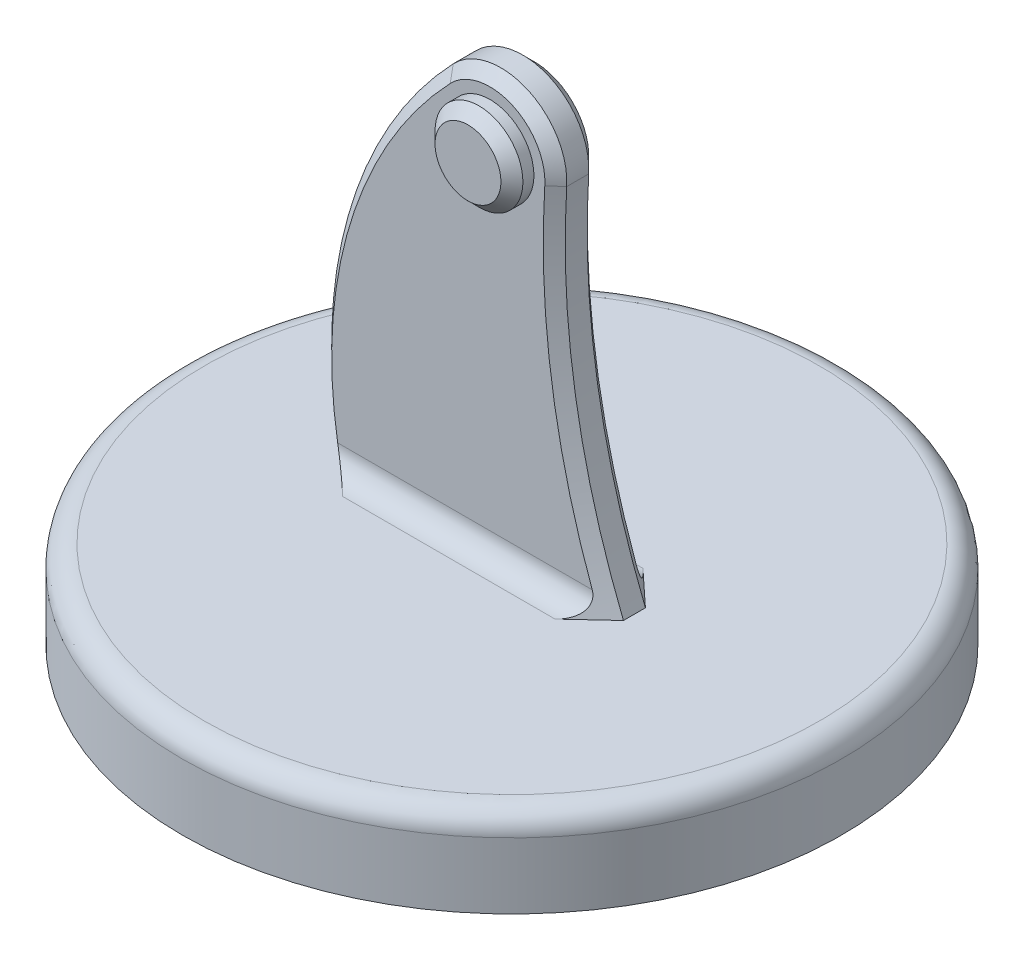
ISO-10303-21;
HEADER;
FILE_DESCRIPTION(('STEP AP214'),'2;1');
FILE_NAME('part.step','',(''),(''),'','','');
FILE_SCHEMA(('AUTOMOTIVE_DESIGN { 1 0 10303 214 1 1 1 1 }'));
ENDSEC;
DATA;
#1=APPLICATION_CONTEXT('core data for automotive mechanical design processes');
#2=APPLICATION_PROTOCOL_DEFINITION('international standard','automotive_design',2000,#1);
#3=PRODUCT_CONTEXT('',#1,'mechanical');
#4=PRODUCT('Part','Part','',(#3));
#5=PRODUCT_RELATED_PRODUCT_CATEGORY('part','',(#4));
#6=PRODUCT_DEFINITION_FORMATION('','',#4);
#7=PRODUCT_DEFINITION_CONTEXT('part definition',#1,'design');
#8=PRODUCT_DEFINITION('design','',#6,#7);
#9=PRODUCT_DEFINITION_SHAPE('','',#8);
#10=(LENGTH_UNIT() NAMED_UNIT(*) SI_UNIT(.MILLI.,.METRE.));
#11=(NAMED_UNIT(*) PLANE_ANGLE_UNIT() SI_UNIT($,.RADIAN.));
#12=(NAMED_UNIT(*) SI_UNIT($,.STERADIAN.) SOLID_ANGLE_UNIT());
#13=UNCERTAINTY_MEASURE_WITH_UNIT(LENGTH_MEASURE(1.E-05),#10,'distance_accuracy_value','');
#14=(GEOMETRIC_REPRESENTATION_CONTEXT(3) GLOBAL_UNCERTAINTY_ASSIGNED_CONTEXT((#13)) GLOBAL_UNIT_ASSIGNED_CONTEXT((#10,
#11,#12)) REPRESENTATION_CONTEXT('',''));
#15=CARTESIAN_POINT('',(0.,0.,0.));
#16=DIRECTION('',(0.,0.,1.));
#17=DIRECTION('',(1.,0.,0.));
#18=AXIS2_PLACEMENT_3D('',#15,#16,#17);
#19=CARTESIAN_POINT('',(0.,20.,0.));
#20=DIRECTION('',(0.,1.,0.));
#21=DIRECTION('',(0.,0.,1.));
#22=AXIS2_PLACEMENT_3D('',#19,#20,#21);
#23=PLANE('',#22);
#24=CARTESIAN_POINT('',(0.,20.,0.));
#25=DIRECTION('',(0.,1.,0.));
#26=DIRECTION('',(0.,0.,1.));
#27=AXIS2_PLACEMENT_3D('',#24,#25,#26);
#28=CIRCLE('',#27,70.);
#29=CARTESIAN_POINT('',(0.,20.,70.));
#30=VERTEX_POINT('',#29);
#31=EDGE_CURVE('E333',#30,#30,#28,.T.);
#32=ORIENTED_EDGE('',*,*,#31,.T.);
#33=EDGE_LOOP('',(#32));
#34=FACE_BOUND('',#33,.T.);
#35=CARTESIAN_POINT('',(-36.2257918410724,20.,-2.50000000000005));
#36=CARTESIAN_POINT('',(-35.372613344394,20.,-3.33359235450625));
#37=CARTESIAN_POINT('',(-34.5191891841924,20.,-4.16693335697092));
#38=CARTESIAN_POINT('',(-32.810937278002,20.,-5.83391380233447));
#39=CARTESIAN_POINT('',(-31.956108987226,20.,-6.66755268694829));
#40=CARTESIAN_POINT('',(-30.2458713230934,20.,-8.33423473891843));
#41=CARTESIAN_POINT('',(-29.3904619495462,20.,-9.16727790607917));
#42=CARTESIAN_POINT('',(-28.5347400447997,20.,-9.99999999999034));
#43=B_SPLINE_CURVE_WITH_KNOTS('',3,(#35,#36,#37,#38,#39,#40,#41,#42),.UNSPECIFIED.,.F.,.F.,(4,2,
2,4),(0.,3.57842257820063,7.16048411375374,10.7425468249048),.UNSPECIFIED.);
#44=CARTESIAN_POINT('',(-36.2257918410724,20.,-2.50000000000005));
#45=VERTEX_POINT('',#44);
#46=CARTESIAN_POINT('',(-28.5347400447997,20.,-10.));
#47=VERTEX_POINT('',#46);
#48=EDGE_CURVE('E203',#45,#47,#43,.T.);
#49=ORIENTED_EDGE('',*,*,#48,.T.);
#50=DIRECTION('',(-1.,0.,0.));
#51=VECTOR('',#50,1.);
#52=CARTESIAN_POINT('',(25.1824752050036,20.,-10.));
#53=LINE('',#52,#51);
#54=CARTESIAN_POINT('',(19.8084097202196,20.,-10.));
#55=VERTEX_POINT('',#54);
#56=EDGE_CURVE('E165',#47,#55,#53,.F.);
#57=ORIENTED_EDGE('',*,*,#56,.T.);
#58=CARTESIAN_POINT('',(19.8084097202196,20.,-10.));
#59=CARTESIAN_POINT('',(20.7032286114695,20.,-9.16574365323038));
#60=CARTESIAN_POINT('',(21.5984643871198,20.,-8.3319343297424));
#61=CARTESIAN_POINT('',(23.3898068938445,20.,-6.66525336176841));
#62=CARTESIAN_POINT('',(24.2859136241594,20.,-5.83238171646611));
#63=CARTESIAN_POINT('',(26.0805990637617,20.,-4.16616784041951));
#64=CARTESIAN_POINT('',(26.979179359604,20.,-3.33282731858597));
#65=CARTESIAN_POINT('',(27.8782351753599,20.,-2.50000000000006));
#66=B_SPLINE_CURVE_WITH_KNOTS('',3,(#58,#59,#60,#61,#62,#63,#64,#65),.UNSPECIFIED.,.F.,.F.,(4,2,
2,4),(0.,3.67017170974666,7.34034022201679,11.0169040821687),.UNSPECIFIED.);
#67=CARTESIAN_POINT('',(27.8782351753599,20.,-2.50000000000005));
#68=VERTEX_POINT('',#67);
#69=EDGE_CURVE('E211',#55,#68,#66,.T.);
#70=ORIENTED_EDGE('',*,*,#69,.T.);
#71=DIRECTION('',(0.,0.,-1.));
#72=VECTOR('',#71,1.);
#73=CARTESIAN_POINT('',(27.8782351753599,20.,5.));
#74=LINE('',#73,#72);
#75=CARTESIAN_POINT('',(27.8782351753599,20.,2.5));
#76=VERTEX_POINT('',#75);
#77=EDGE_CURVE('E140',#68,#76,#74,.F.);
#78=ORIENTED_EDGE('',*,*,#77,.T.);
#79=CARTESIAN_POINT('',(27.8782351753599,20.,2.5));
#80=CARTESIAN_POINT('',(26.979179359604,20.,3.33282731858595));
#81=CARTESIAN_POINT('',(26.0805990637617,20.,4.1661678404195));
#82=CARTESIAN_POINT('',(24.2859136241592,20.,5.83238171646611));
#83=CARTESIAN_POINT('',(23.3898068938443,20.,6.66525336176839));
#84=CARTESIAN_POINT('',(21.5984643871196,20.,8.33193432974237));
#85=CARTESIAN_POINT('',(20.7032286114693,20.,9.16574365323034));
#86=CARTESIAN_POINT('',(19.8084097202194,20.,10.));
#87=B_SPLINE_CURVE_WITH_KNOTS('',3,(#79,#80,#81,#82,#83,#84,#85,#86),.UNSPECIFIED.,.F.,.F.,(4,2,
2,4),(0.,3.67656386015204,7.34673237242222,11.0169040821689),.UNSPECIFIED.);
#88=CARTESIAN_POINT('',(19.8084097202194,20.,10.));
#89=VERTEX_POINT('',#88);
#90=EDGE_CURVE('E162',#76,#89,#87,.T.);
#91=ORIENTED_EDGE('',*,*,#90,.T.);
#92=DIRECTION('',(-1.,0.,0.));
#93=VECTOR('',#92,1.);
#94=CARTESIAN_POINT('',(0.,20.,10.));
#95=LINE('',#94,#93);
#96=CARTESIAN_POINT('',(-28.5347400447895,20.,10.));
#97=VERTEX_POINT('',#96);
#98=EDGE_CURVE('E161',#89,#97,#95,.T.);
#99=ORIENTED_EDGE('',*,*,#98,.T.);
#100=CARTESIAN_POINT('',(-28.5347400447895,20.,10.));
#101=CARTESIAN_POINT('',(-29.3904619495377,20.,9.16727790608722));
#102=CARTESIAN_POINT('',(-30.2458713230866,20.,8.33423473892487));
#103=CARTESIAN_POINT('',(-31.9561089872225,20.,6.66755268695151));
#104=CARTESIAN_POINT('',(-32.8109372780002,20.,5.83391380233608));
#105=CARTESIAN_POINT('',(-34.5191891841924,20.,4.16693335697091));
#106=CARTESIAN_POINT('',(-35.372613344394,20.,3.33359235450621));
#107=CARTESIAN_POINT('',(-36.2257918410724,20.,2.49999999999999));
#108=B_SPLINE_CURVE_WITH_KNOTS('',3,(#100,#101,#102,#103,#104,#105,#106,#107),.UNSPECIFIED.,.F.,
.F.,(4,2,2,4),(0.,3.582062711158,7.1641242467181,10.7425468249188),.UNSPECIFIED.);
#109=CARTESIAN_POINT('',(-36.2257918410724,20.,2.5));
#110=VERTEX_POINT('',#109);
#111=EDGE_CURVE('E231',#97,#110,#108,.T.);
#112=ORIENTED_EDGE('',*,*,#111,.T.);
#113=DIRECTION('',(0.,0.,-1.));
#114=VECTOR('',#113,1.);
#115=CARTESIAN_POINT('',(-36.2257918410724,20.,5.));
#116=LINE('',#115,#114);
#117=EDGE_CURVE('E342',#45,#110,#116,.F.);
#118=ORIENTED_EDGE('',*,*,#117,.F.);
#119=EDGE_LOOP('',(#49,#57,#70,#78,#91,#99,#112,#118));
#120=FACE_BOUND('',#119,.T.);
#121=ADVANCED_FACE('F40',(#34,#120),#23,.T.);
#122=CARTESIAN_POINT('',(0.,20.,0.));
#123=DIRECTION('',(0.,-1.,0.));
#124=DIRECTION('',(0.,0.,-1.));
#125=AXIS2_PLACEMENT_3D('',#122,#123,#124);
#126=CYLINDRICAL_SURFACE('',#125,75.);
#127=CARTESIAN_POINT('',(0.,15.,0.));
#128=DIRECTION('',(0.,1.,0.));
#129=DIRECTION('',(0.,0.,1.));
#130=AXIS2_PLACEMENT_3D('',#127,#128,#129);
#131=CIRCLE('',#130,75.);
#132=CARTESIAN_POINT('',(0.,15.,75.));
#133=VERTEX_POINT('',#132);
#134=EDGE_CURVE('E339',#133,#133,#131,.F.);
#135=ORIENTED_EDGE('',*,*,#134,.T.);
#136=EDGE_LOOP('',(#135));
#137=FACE_BOUND('',#136,.T.);
#138=CARTESIAN_POINT('',(0.,0.,0.));
#139=DIRECTION('',(0.,1.,0.));
#140=DIRECTION('',(0.,0.,1.));
#141=AXIS2_PLACEMENT_3D('',#138,#139,#140);
#142=CIRCLE('',#141,75.);
#143=CARTESIAN_POINT('',(0.,0.,75.));
#144=VERTEX_POINT('',#143);
#145=EDGE_CURVE('E330',#144,#144,#142,.T.);
#146=ORIENTED_EDGE('',*,*,#145,.T.);
#147=EDGE_LOOP('',(#146));
#148=FACE_BOUND('',#147,.T.);
#149=ADVANCED_FACE('F223',(#137,#148),#126,.T.);
#150=CARTESIAN_POINT('',(0.,0.,0.));
#151=DIRECTION('',(0.,1.,0.));
#152=DIRECTION('',(0.,0.,1.));
#153=AXIS2_PLACEMENT_3D('',#150,#151,#152);
#154=PLANE('',#153);
#155=ORIENTED_EDGE('',*,*,#145,.F.);
#156=EDGE_LOOP('',(#155));
#157=FACE_BOUND('',#156,.T.);
#158=ADVANCED_FACE('F227',(#157),#154,.F.);
#159=CARTESIAN_POINT('',(0.,15.,0.));
#160=DIRECTION('',(0.,1.,0.));
#161=DIRECTION('',(0.,0.,1.));
#162=AXIS2_PLACEMENT_3D('',#159,#160,#161);
#163=TOROIDAL_SURFACE('',#162,70.,5.);
#164=ORIENTED_EDGE('',*,*,#134,.F.);
#165=EDGE_LOOP('',(#164));
#166=FACE_BOUND('',#165,.T.);
#167=ORIENTED_EDGE('',*,*,#31,.F.);
#168=EDGE_LOOP('',(#167));
#169=FACE_BOUND('',#168,.T.);
#170=ADVANCED_FACE('F199',(#166,#169),#163,.T.);
#171=CARTESIAN_POINT('',(194.618391581677,87.8064911464742,5.));
#172=DIRECTION('',(0.,0.,-1.));
#173=DIRECTION('',(-1.,0.,0.));
#174=AXIS2_PLACEMENT_3D('',#171,#172,#173);
#175=CYLINDRICAL_SURFACE('',#174,180.);
#176=ORIENTED_EDGE('',*,*,#77,.F.);
#177=CARTESIAN_POINT('',(194.618391581677,87.8064911464742,-2.50000000000005));
#178=DIRECTION('',(0.,0.,-1.));
#179=DIRECTION('',(-1.,0.,0.));
#180=AXIS2_PLACEMENT_3D('',#177,#178,#179);
#181=CIRCLE('',#180,180.);
#182=CARTESIAN_POINT('',(14.9706455062829,99.062037780498,-2.50000000000005));
#183=VERTEX_POINT('',#182);
#184=EDGE_CURVE('E357',#68,#183,#181,.T.);
#185=ORIENTED_EDGE('',*,*,#184,.T.);
#186=DIRECTION('',(0.,0.,-1.));
#187=VECTOR('',#186,1.);
#188=CARTESIAN_POINT('',(14.9706455062829,99.062037780498,5.));
#189=LINE('',#188,#187);
#190=CARTESIAN_POINT('',(14.9706455062829,99.062037780498,2.5));
#191=VERTEX_POINT('',#190);
#192=EDGE_CURVE('E148',#191,#183,#189,.T.);
#193=ORIENTED_EDGE('',*,*,#192,.F.);
#194=CARTESIAN_POINT('',(194.618391581677,87.8064911464742,2.5));
#195=DIRECTION('',(0.,0.,-1.));
#196=DIRECTION('',(-1.,0.,0.));
#197=AXIS2_PLACEMENT_3D('',#194,#195,#196);
#198=CIRCLE('',#197,180.);
#199=EDGE_CURVE('E355',#191,#76,#198,.F.);
#200=ORIENTED_EDGE('',*,*,#199,.T.);
#201=EDGE_LOOP('',(#176,#185,#193,#200));
#202=FACE_BOUND('',#201,.T.);
#203=ADVANCED_FACE('F225',(#202),#175,.F.);
#204=CARTESIAN_POINT('',(0.,100.,5.));
#205=DIRECTION('',(0.,0.,-1.));
#206=DIRECTION('',(-1.,0.,0.));
#207=AXIS2_PLACEMENT_3D('',#204,#205,#206);
#208=CYLINDRICAL_SURFACE('',#207,15.);
#209=ORIENTED_EDGE('',*,*,#192,.T.);
#210=CARTESIAN_POINT('',(0.,100.,-2.50000000000005));
#211=DIRECTION('',(0.,0.,-1.));
#212=DIRECTION('',(-1.,0.,0.));
#213=AXIS2_PLACEMENT_3D('',#210,#211,#212);
#214=CIRCLE('',#213,15.);
#215=CARTESIAN_POINT('',(-10.8492014290604,110.358321695703,-2.50000000000005));
#216=VERTEX_POINT('',#215);
#217=EDGE_CURVE('E143',#183,#216,#214,.F.);
#218=ORIENTED_EDGE('',*,*,#217,.T.);
#219=DIRECTION('',(0.,0.,-1.));
#220=VECTOR('',#219,1.);
#221=CARTESIAN_POINT('',(-10.8492014290604,110.358321695703,5.));
#222=LINE('',#221,#220);
#223=CARTESIAN_POINT('',(-10.8492014290604,110.358321695703,2.5));
#224=VERTEX_POINT('',#223);
#225=EDGE_CURVE('E144',#224,#216,#222,.T.);
#226=ORIENTED_EDGE('',*,*,#225,.F.);
#227=CARTESIAN_POINT('',(0.,100.,2.5));
#228=DIRECTION('',(0.,0.,-1.));
#229=DIRECTION('',(-1.,0.,0.));
#230=AXIS2_PLACEMENT_3D('',#227,#228,#229);
#231=CIRCLE('',#230,15.);
#232=EDGE_CURVE('E328',#224,#191,#231,.T.);
#233=ORIENTED_EDGE('',*,*,#232,.T.);
#234=EDGE_LOOP('',(#209,#218,#226,#233));
#235=FACE_BOUND('',#234,.T.);
#236=ADVANCED_FACE('F316',(#235),#208,.T.);
#237=CARTESIAN_POINT('',(61.4788080980091,41.3028437243492,5.));
#238=DIRECTION('',(0.,0.,-1.));
#239=DIRECTION('',(-1.,0.,0.));
#240=AXIS2_PLACEMENT_3D('',#237,#238,#239);
#241=CYLINDRICAL_SURFACE('',#240,100.);
#242=ORIENTED_EDGE('',*,*,#225,.T.);
#243=CARTESIAN_POINT('',(61.4788080980091,41.3028437243492,-2.50000000000005));
#244=DIRECTION('',(0.,0.,-1.));
#245=DIRECTION('',(-1.,0.,0.));
#246=AXIS2_PLACEMENT_3D('',#243,#244,#245);
#247=CIRCLE('',#246,100.);
#248=EDGE_CURVE('E351',#216,#45,#247,.F.);
#249=ORIENTED_EDGE('',*,*,#248,.T.);
#250=ORIENTED_EDGE('',*,*,#117,.T.);
#251=CARTESIAN_POINT('',(61.4788080980091,41.3028437243492,2.5));
#252=DIRECTION('',(0.,0.,-1.));
#253=DIRECTION('',(-1.,0.,0.));
#254=AXIS2_PLACEMENT_3D('',#251,#252,#253);
#255=CIRCLE('',#254,100.);
#256=EDGE_CURVE('E348',#110,#224,#255,.T.);
#257=ORIENTED_EDGE('',*,*,#256,.T.);
#258=EDGE_LOOP('',(#242,#249,#250,#257));
#259=FACE_BOUND('',#258,.T.);
#260=ADVANCED_FACE('F310',(#259),#241,.T.);
#261=CARTESIAN_POINT('',(194.618391581677,87.8064911464742,5.));
#262=DIRECTION('',(0.,0.,-1.));
#263=DIRECTION('',(-1.,0.,0.));
#264=AXIS2_PLACEMENT_3D('',#261,#262,#263);
#265=PLANE('',#264);
#266=CARTESIAN_POINT('',(0.,100.,5.));
#267=DIRECTION('',(0.,0.,-1.));
#268=DIRECTION('',(-1.,0.,0.));
#269=AXIS2_PLACEMENT_3D('',#266,#267,#268);
#270=CIRCLE('',#269,10.);
#271=CARTESIAN_POINT('',(-10.,100.,5.));
#272=VERTEX_POINT('',#271);
#273=EDGE_CURVE('E283',#272,#272,#270,.F.);
#274=ORIENTED_EDGE('',*,*,#273,.F.);
#275=EDGE_LOOP('',(#274));
#276=FACE_BOUND('',#275,.T.);
#277=CARTESIAN_POINT('',(61.4788080980091,41.3028437243492,5.));
#278=DIRECTION('',(0.,0.,-1.));
#279=DIRECTION('',(-1.,0.,0.));
#280=AXIS2_PLACEMENT_3D('',#277,#278,#279);
#281=CIRCLE('',#280,97.4999999999999);
#282=CARTESIAN_POINT('',(-9.04100119088367,108.631934746419,5.));
#283=VERTEX_POINT('',#282);
#284=CARTESIAN_POINT('',(-34.6485412178825,25.,5.));
#285=VERTEX_POINT('',#284);
#286=EDGE_CURVE('E212',#283,#285,#281,.F.);
#287=ORIENTED_EDGE('',*,*,#286,.T.);
#288=DIRECTION('',(-1.,0.,0.));
#289=VECTOR('',#288,1.);
#290=CARTESIAN_POINT('',(194.618391581677,25.,5.));
#291=LINE('',#290,#289);
#292=CARTESIAN_POINT('',(23.2661384016624,25.,5.));
#293=VERTEX_POINT('',#292);
#294=EDGE_CURVE('E56',#285,#293,#291,.F.);
#295=ORIENTED_EDGE('',*,*,#294,.T.);
#296=CARTESIAN_POINT('',(194.618391581677,87.8064911464742,5.));
#297=DIRECTION('',(0.,0.,-1.));
#298=DIRECTION('',(-1.,0.,0.));
#299=AXIS2_PLACEMENT_3D('',#296,#297,#298);
#300=CIRCLE('',#299,182.5);
#301=CARTESIAN_POINT('',(12.4755379219024,99.2183648170817,5.));
#302=VERTEX_POINT('',#301);
#303=EDGE_CURVE('E359',#293,#302,#300,.T.);
#304=ORIENTED_EDGE('',*,*,#303,.T.);
#305=CARTESIAN_POINT('',(0.,100.,5.));
#306=DIRECTION('',(0.,0.,-1.));
#307=DIRECTION('',(-1.,0.,0.));
#308=AXIS2_PLACEMENT_3D('',#305,#306,#307);
#309=CIRCLE('',#308,12.5);
#310=EDGE_CURVE('E360',#302,#283,#309,.F.);
#311=ORIENTED_EDGE('',*,*,#310,.T.);
#312=EDGE_LOOP('',(#287,#295,#304,#311));
#313=FACE_BOUND('',#312,.T.);
#314=ADVANCED_FACE('F307',(#276,#313),#265,.F.);
#315=CARTESIAN_POINT('',(194.618391581677,87.8064911464742,-5.));
#316=DIRECTION('',(0.,0.,-1.));
#317=DIRECTION('',(-1.,0.,0.));
#318=AXIS2_PLACEMENT_3D('',#315,#316,#317);
#319=PLANE('',#318);
#320=CARTESIAN_POINT('',(0.,100.,-5.));
#321=DIRECTION('',(0.,0.,-1.));
#322=DIRECTION('',(-1.,0.,0.));
#323=AXIS2_PLACEMENT_3D('',#320,#321,#322);
#324=CIRCLE('',#323,5.);
#325=CARTESIAN_POINT('',(-5.,100.,-5.));
#326=VERTEX_POINT('',#325);
#327=EDGE_CURVE('E447',#326,#326,#324,.T.);
#328=ORIENTED_EDGE('',*,*,#327,.F.);
#329=EDGE_LOOP('',(#328));
#330=FACE_BOUND('',#329,.T.);
#331=CARTESIAN_POINT('',(194.618391581677,87.8064911464742,-5.));
#332=DIRECTION('',(0.,0.,-1.));
#333=DIRECTION('',(-1.,0.,0.));
#334=AXIS2_PLACEMENT_3D('',#331,#332,#333);
#335=CIRCLE('',#334,182.5);
#336=CARTESIAN_POINT('',(12.4755379219025,99.2183648170817,-5.));
#337=VERTEX_POINT('',#336);
#338=CARTESIAN_POINT('',(23.2661384016625,25.,-5.));
#339=VERTEX_POINT('',#338);
#340=EDGE_CURVE('E123',#337,#339,#335,.F.);
#341=ORIENTED_EDGE('',*,*,#340,.T.);
#342=DIRECTION('',(-1.,0.,0.));
#343=VECTOR('',#342,1.);
#344=CARTESIAN_POINT('',(-33.6654972978262,25.,-5.));
#345=LINE('',#344,#343);
#346=CARTESIAN_POINT('',(-34.6485412178826,25.,-5.));
#347=VERTEX_POINT('',#346);
#348=EDGE_CURVE('E159',#339,#347,#345,.T.);
#349=ORIENTED_EDGE('',*,*,#348,.T.);
#350=CARTESIAN_POINT('',(61.4788080980091,41.3028437243492,-5.));
#351=DIRECTION('',(0.,0.,-1.));
#352=DIRECTION('',(-1.,0.,0.));
#353=AXIS2_PLACEMENT_3D('',#350,#351,#352);
#354=CIRCLE('',#353,97.5000000000001);
#355=CARTESIAN_POINT('',(-9.04100119088373,108.631934746419,-5.));
#356=VERTEX_POINT('',#355);
#357=EDGE_CURVE('E126',#347,#356,#354,.T.);
#358=ORIENTED_EDGE('',*,*,#357,.T.);
#359=CARTESIAN_POINT('',(0.,100.,-5.));
#360=DIRECTION('',(0.,0.,-1.));
#361=DIRECTION('',(-1.,0.,0.));
#362=AXIS2_PLACEMENT_3D('',#359,#360,#361);
#363=CIRCLE('',#362,12.5000000000001);
#364=EDGE_CURVE('E119',#356,#337,#363,.T.);
#365=ORIENTED_EDGE('',*,*,#364,.T.);
#366=EDGE_LOOP('',(#341,#349,#358,#365));
#367=FACE_BOUND('',#366,.T.);
#368=ADVANCED_FACE('F121',(#330,#367),#319,.T.);
#369=CARTESIAN_POINT('',(194.618391581677,87.8064911464742,-2.50000000000005));
#370=DIRECTION('',(0.,0.,-1.));
#371=DIRECTION('',(-1.,0.,0.));
#372=AXIS2_PLACEMENT_3D('',#369,#370,#371);
#373=CONICAL_SURFACE('',#372,180.,0.785398163397448);
#374=ORIENTED_EDGE('',*,*,#69,.F.);
#375=CARTESIAN_POINT('',(19.8084097202196,20.,-10.));
#376=CARTESIAN_POINT('',(19.9616222001361,20.0000298804788,-9.85714704113471));
#377=CARTESIAN_POINT('',(20.1137924014272,20.0061250464787,-9.71309524720425));
#378=CARTESIAN_POINT('',(20.4154099258563,20.0312732005136,-9.42286389259003));
#379=CARTESIAN_POINT('',(20.5648530266058,20.0503447774578,-9.27668157427058));
#380=CARTESIAN_POINT('',(20.8615528966935,20.102562652016,-8.98125926298962));
#381=CARTESIAN_POINT('',(21.0087676549956,20.1358611613083,-8.83200332023084));
#382=CARTESIAN_POINT('',(21.2980316141235,20.2175964036354,-8.53280806026068));
#383=CARTESIAN_POINT('',(21.4400838108926,20.2660241950172,-8.38286919811181));
#384=CARTESIAN_POINT('',(21.7828151280986,20.4058352198909,-8.01276165533595));
#385=CARTESIAN_POINT('',(21.9797828513876,20.5067135935973,-7.79259954802384));
#386=CARTESIAN_POINT('',(22.3528762269487,20.7482032050806,-7.35729519112309));
#387=CARTESIAN_POINT('',(22.5290705137558,20.8886780845711,-7.14213841034354));
#388=CARTESIAN_POINT('',(22.8168193138977,21.1785477540737,-6.76898245708679));
#389=CARTESIAN_POINT('',(22.9340909878662,21.319317167827,-6.60875060095627));
#390=CARTESIAN_POINT('',(23.144778257543,21.6294430522973,-6.30040897895643));
#391=CARTESIAN_POINT('',(23.2382153446303,21.7987735392681,-6.15228837499195));
#392=CARTESIAN_POINT('',(23.3804737185195,22.1320581970212,-5.89995104941321));
#393=CARTESIAN_POINT('',(23.434296278932,22.2915049540279,-5.79262885058204));
#394=CARTESIAN_POINT('',(23.5179262343763,22.6263855761311,-5.5950448914265));
#395=CARTESIAN_POINT('',(23.5477623016995,22.8018000739712,-5.50476286123898));
#396=CARTESIAN_POINT('',(23.5813327898914,23.1648092903734,-5.34473112728066));
#397=CARTESIAN_POINT('',(23.5849884501377,23.3524390501042,-5.27504398310997));
#398=CARTESIAN_POINT('',(23.5658130806125,23.733709875505,-5.15889768650513));
#399=CARTESIAN_POINT('',(23.5429456120539,23.9273588546123,-5.11247061551667));
#400=CARTESIAN_POINT('',(23.4808763212381,24.2692712797722,-5.05137708232073));
#401=CARTESIAN_POINT('',(23.4467017445591,24.4176298806951,-5.03183845273443));
#402=CARTESIAN_POINT('',(23.3858266399033,24.63802725972,-5.01257591131647));
#403=CARTESIAN_POINT('',(23.3639728403138,24.7110279587234,-5.00782892798884));
#404=CARTESIAN_POINT('',(23.31726040923,24.8561887780631,-5.00154052901006));
#405=CARTESIAN_POINT('',(23.2924023157315,24.92834904637,-4.99999854031963));
#406=CARTESIAN_POINT('',(23.2661384016625,25.,-4.99999999999999));
#407=B_SPLINE_CURVE_WITH_KNOTS('',3,(#375,#376,#377,#378,#379,#380,#381,#382,#383,#384,#385,
#386,#387,#388,#389,#390,#391,#392,#393,#394,#395,#396,#397,#398,#399,#400,#401,#402,#403,#404,
#405,#406),.UNSPECIFIED.,.F.,.F.,(4,2,2,2,2,2,2,2,2,2,2,2,2,2,2,4),(0.,0.628421039599243,
1.25774420264553,1.89397597557041,2.52983243422467,3.46357701051967,4.39414453597983,
5.12178326458134,5.84876355163266,6.44503340286863,7.0405894378157,7.63793638210255,
8.23610496422998,8.69534624701092,8.92427835401003,9.15316952540912),.UNSPECIFIED.);
#408=EDGE_CURVE('E139',#55,#339,#407,.T.);
#409=ORIENTED_EDGE('',*,*,#408,.T.);
#410=ORIENTED_EDGE('',*,*,#340,.F.);
#411=DIRECTION('',(-0.705722997082165,0.0442159630604438,-0.70710678118655));
#412=VECTOR('',#411,1.);
#413=CARTESIAN_POINT('',(14.9706455062829,99.062037780498,-2.50000000000005));
#414=LINE('',#413,#412);
#415=EDGE_CURVE('E136',#183,#337,#414,.T.);
#416=ORIENTED_EDGE('',*,*,#415,.F.);
#417=ORIENTED_EDGE('',*,*,#184,.F.);
#418=EDGE_LOOP('',(#374,#409,#410,#416,#417));
#419=FACE_BOUND('',#418,.T.);
#420=ADVANCED_FACE('F134',(#419),#373,.F.);
#421=CARTESIAN_POINT('',(0.,100.,-2.50000000000005));
#422=DIRECTION('',(0.,0.,1.));
#423=DIRECTION('',(1.,0.,0.));
#424=AXIS2_PLACEMENT_3D('',#421,#422,#423);
#425=CONICAL_SURFACE('',#424,15.,0.78539816339745);
#426=ORIENTED_EDGE('',*,*,#415,.T.);
#427=ORIENTED_EDGE('',*,*,#364,.F.);
#428=DIRECTION('',(0.511436260063162,-0.488295967516226,-0.707106781186546));
#429=VECTOR('',#428,1.);
#430=CARTESIAN_POINT('',(-10.8492014290604,110.358321695703,-2.50000000000005));
#431=LINE('',#430,#429);
#432=EDGE_CURVE('E145',#216,#356,#431,.T.);
#433=ORIENTED_EDGE('',*,*,#432,.F.);
#434=ORIENTED_EDGE('',*,*,#217,.F.);
#435=EDGE_LOOP('',(#426,#427,#433,#434));
#436=FACE_BOUND('',#435,.T.);
#437=ADVANCED_FACE('F142',(#436),#425,.T.);
#438=CARTESIAN_POINT('',(61.4788080980091,41.3028437243492,-5.));
#439=DIRECTION('',(0.,0.,1.));
#440=DIRECTION('',(1.,0.,0.));
#441=AXIS2_PLACEMENT_3D('',#438,#439,#440);
#442=CONICAL_SURFACE('',#441,97.5000000000001,0.785398163397448);
#443=ORIENTED_EDGE('',*,*,#48,.F.);
#444=ORIENTED_EDGE('',*,*,#248,.F.);
#445=ORIENTED_EDGE('',*,*,#432,.T.);
#446=ORIENTED_EDGE('',*,*,#357,.F.);
#447=CARTESIAN_POINT('',(-34.6485412178826,25.,-5.));
#448=CARTESIAN_POINT('',(-34.6278263931647,24.8776737195309,-4.99997205696549));
#449=CARTESIAN_POINT('',(-34.6024065399033,24.7562262915276,-5.00448739117207));
#450=CARTESIAN_POINT('',(-34.5429849208856,24.5162780856462,-5.02201019394859));
#451=CARTESIAN_POINT('',(-34.508997529844,24.3977727337697,-5.03500349551893));
#452=CARTESIAN_POINT('',(-34.4336064530608,24.1657504184647,-5.06870753536354));
#453=CARTESIAN_POINT('',(-34.3922873438699,24.0521932495797,-5.08933290323475));
#454=CARTESIAN_POINT('',(-34.3028186663442,23.8293395597508,-5.13763804893629));
#455=CARTESIAN_POINT('',(-34.2546663483715,23.7200447766429,-5.16532067014758));
#456=CARTESIAN_POINT('',(-34.1018999874642,23.4007855163625,-5.25749953763443));
#457=CARTESIAN_POINT('',(-33.988389425009,23.1977010164338,-5.33139897333394));
#458=CARTESIAN_POINT('',(-33.743108128065,22.8114075187661,-5.49947966844371));
#459=CARTESIAN_POINT('',(-33.6112792288649,22.6282652833932,-5.59372608368114));
#460=CARTESIAN_POINT('',(-33.3597715899799,22.3143795242672,-5.77930779563057));
#461=CARTESIAN_POINT('',(-33.2423430904443,22.1802045011359,-5.86796813176537));
#462=CARTESIAN_POINT('',(-33.0003701704359,21.9250062885372,-6.05419427532));
#463=CARTESIAN_POINT('',(-32.8758222627861,21.803989629899,-6.15176446112315));
#464=CARTESIAN_POINT('',(-32.6209581839141,21.574515672378,-6.35451763345837));
#465=CARTESIAN_POINT('',(-32.4906317175558,21.4660821453441,-6.45971443821714));
#466=CARTESIAN_POINT('',(-32.2256565914919,21.261571364397,-6.67639624695991));
#467=CARTESIAN_POINT('',(-32.0910081512862,21.1654934842151,-6.78788093181871));
#468=CARTESIAN_POINT('',(-31.7670829795191,20.9513521781691,-7.0591623462626));
#469=CARTESIAN_POINT('',(-31.5762977372456,20.8386006241572,-7.22136644551831));
#470=CARTESIAN_POINT('',(-31.1903799013301,20.6347373401019,-7.55407285197028));
#471=CARTESIAN_POINT('',(-30.9952453847092,20.543635398434,-7.72457887087088));
#472=CARTESIAN_POINT('',(-30.6024455629517,20.3825905264103,-8.07225279463919));
#473=CARTESIAN_POINT('',(-30.4047817757245,20.312635473578,-8.24941681705509));
#474=CARTESIAN_POINT('',(-30.0083154260173,20.1935947017099,-8.60919264195969));
#475=CARTESIAN_POINT('',(-29.8095134145847,20.144499628215,-8.79180196315535));
#476=CARTESIAN_POINT('',(-29.430440932106,20.0707858186542,-9.14430295407237));
#477=CARTESIAN_POINT('',(-29.2501629713125,20.0443183217429,-9.31380200505617));
#478=CARTESIAN_POINT('',(-28.8911755946431,20.0089730286601,-9.65518491269285));
#479=CARTESIAN_POINT('',(-28.7124631020956,20.0000429318062,-9.82706013433486));
#480=CARTESIAN_POINT('',(-28.534740044795,20.,-9.99999999999494));
#481=B_SPLINE_CURVE_WITH_KNOTS('',3,(#447,#448,#449,#450,#451,#452,#453,#454,#455,#456,#457,
#458,#459,#460,#461,#462,#463,#464,#465,#466,#467,#468,#469,#470,#471,#472,#473,#474,#475,#476,
#477,#478,#479,#480),.UNSPECIFIED.,.F.,.F.,(4,2,2,2,2,2,2,2,2,2,2,2,2,2,2,2,4),(0.,
0.371910340457602,0.74320079101391,1.11045779196235,1.47786299596238,2.20715942536886,
2.93882682183086,3.53541228861898,4.13229251712416,4.73028261116158,5.3282423830098,
6.15097947183994,6.97408783764376,7.79672345698735,8.61898978287108,9.3649414633821,
10.1086651405441),.UNSPECIFIED.);
#482=EDGE_CURVE('E169',#347,#47,#481,.T.);
#483=ORIENTED_EDGE('',*,*,#482,.T.);
#484=EDGE_LOOP('',(#443,#444,#445,#446,#483));
#485=FACE_BOUND('',#484,.T.);
#486=ADVANCED_FACE('F188',(#485),#442,.T.);
#487=CARTESIAN_POINT('',(194.618391581677,87.8064911464742,5.));
#488=DIRECTION('',(0.,0.,1.));
#489=DIRECTION('',(1.,0.,0.));
#490=AXIS2_PLACEMENT_3D('',#487,#488,#489);
#491=CONICAL_SURFACE('',#490,182.5,0.785398163397459);
#492=ORIENTED_EDGE('',*,*,#90,.F.);
#493=ORIENTED_EDGE('',*,*,#199,.F.);
#494=DIRECTION('',(0.70572299708217,-0.0442159630604425,-0.707106781186546));
#495=VECTOR('',#494,1.);
#496=CARTESIAN_POINT('',(12.4755379219024,99.2183648170817,5.));
#497=LINE('',#496,#495);
#498=EDGE_CURVE('E150',#302,#191,#497,.T.);
#499=ORIENTED_EDGE('',*,*,#498,.F.);
#500=ORIENTED_EDGE('',*,*,#303,.F.);
#501=CARTESIAN_POINT('',(23.2661384016624,25.,5.));
#502=CARTESIAN_POINT('',(23.3002005671833,24.9070970588888,4.99998982101167));
#503=CARTESIAN_POINT('',(23.3319003658589,24.8132947634358,5.00258916549921));
#504=CARTESIAN_POINT('',(23.3901604515583,24.624343126443,5.01323591479231));
#505=CARTESIAN_POINT('',(23.4167170425787,24.5291928685387,5.02128721893147));
#506=CARTESIAN_POINT('',(23.4642590261445,24.3379983044757,5.04308274610182));
#507=CARTESIAN_POINT('',(23.4852365999852,24.2419529368185,5.05683489026829));
#508=CARTESIAN_POINT('',(23.5211837982653,24.0497650147842,5.09015681555101));
#509=CARTESIAN_POINT('',(23.5361548951619,23.9536224900254,5.10972516880294));
#510=CARTESIAN_POINT('',(23.5598434730769,23.7615087850931,5.15480488443814));
#511=CARTESIAN_POINT('',(23.5685335526405,23.6655401561134,5.18034165170113));
#512=CARTESIAN_POINT('',(23.579358971121,23.4749236099918,5.23722376580067));
#513=CARTESIAN_POINT('',(23.5814919758389,23.3802761751035,5.26857117691084));
#514=CARTESIAN_POINT('',(23.5791344482645,23.1932936963799,5.33677201100208));
#515=CARTESIAN_POINT('',(23.5746576512133,23.1009542616797,5.37361387353917));
#516=CARTESIAN_POINT('',(23.5591775223304,22.919061246429,5.45252524641228));
#517=CARTESIAN_POINT('',(23.5481717304808,22.8295087293356,5.49459672245525));
#518=CARTESIAN_POINT('',(23.520532895729,22.6581681393705,5.58133674973435));
#519=CARTESIAN_POINT('',(23.5042028834637,22.5762147571267,5.62577615786902));
#520=CARTESIAN_POINT('',(23.466096025912,22.4158463901558,5.71855815688244));
#521=CARTESIAN_POINT('',(23.4443173998559,22.3374325721739,5.76690202034875));
#522=CARTESIAN_POINT('',(23.3712669897884,22.1079558946016,5.91717329223243));
#523=CARTESIAN_POINT('',(23.3122859316015,21.9626892734793,6.02432427062641));
#524=CARTESIAN_POINT('',(23.151924605642,21.6389242665395,6.29030441266746));
#525=CARTESIAN_POINT('',(23.0429297160745,21.4679275550975,6.4536187634793));
#526=CARTESIAN_POINT('',(22.8002588719763,21.1580788280493,6.79181102146742));
#527=CARTESIAN_POINT('',(22.6665421365392,21.0192807927284,6.96670772427773));
#528=CARTESIAN_POINT('',(22.319763824735,20.7186526437609,7.39885475877627));
#529=CARTESIAN_POINT('',(22.0972299147782,20.5723698914756,7.65932857124395));
#530=CARTESIAN_POINT('',(21.7458214725293,20.3928428518393,8.05194856088023));
#531=CARTESIAN_POINT('',(21.6254999159944,20.3395856596789,8.18339715955418));
#532=CARTESIAN_POINT('',(21.380034828669,20.2454846645251,8.44627656448094));
#533=CARTESIAN_POINT('',(21.2548922835545,20.2046383390844,8.57770736891516));
#534=CARTESIAN_POINT('',(21.0216039690424,20.1402893934769,8.81843555286564));
#535=CARTESIAN_POINT('',(20.9140295433623,20.115042165326,8.92783397103434));
#536=CARTESIAN_POINT('',(20.6966536902156,20.0722321318853,9.14592246129717));
#537=CARTESIAN_POINT('',(20.5868522553934,20.0546693519809,9.25461253105012));
#538=CARTESIAN_POINT('',(20.3664141647905,20.0269838470988,9.47008454014684));
#539=CARTESIAN_POINT('',(20.2557937252112,20.0167960789621,9.57687485159776));
#540=CARTESIAN_POINT('',(20.0331107499652,20.0033093732439,9.78932326315866));
#541=CARTESIAN_POINT('',(19.9210486204084,20.0000085366556,9.89498166738485));
#542=CARTESIAN_POINT('',(19.8084097202194,20.,10.));
#543=B_SPLINE_CURVE_WITH_KNOTS('',3,(#501,#502,#503,#504,#505,#506,#507,#508,#509,#510,#511,
#512,#513,#514,#515,#516,#517,#518,#519,#520,#521,#522,#523,#524,#525,#526,#527,#528,#529,#530,
#531,#532,#533,#534,#535,#536,#537,#538,#539,#540,#541,#542),.UNSPECIFIED.,.F.,.F.,(4,2,2,2,2,2,
2,2,2,2,2,2,2,2,2,2,2,2,2,2,4),(0.,0.296831377796506,0.59387527895407,0.891333303938966,
1.18871836397785,1.48739308625392,1.78617411897318,2.08433515458881,2.38260860379718,
2.66622794573049,2.94994010430045,3.51747042312945,4.29430082789699,5.07242430682295,
6.18341813208096,6.7410845529198,7.29863755488184,7.76491483358028,8.23119365260233,
8.69330833935972,9.15529558547919),.UNSPECIFIED.);
#544=EDGE_CURVE('E258',#293,#89,#543,.T.);
#545=ORIENTED_EDGE('',*,*,#544,.T.);
#546=EDGE_LOOP('',(#492,#493,#499,#500,#545));
#547=FACE_BOUND('',#546,.T.);
#548=ADVANCED_FACE('F197',(#547),#491,.F.);
#549=CARTESIAN_POINT('',(0.,100.,5.));
#550=DIRECTION('',(0.,0.,-1.));
#551=DIRECTION('',(-1.,0.,0.));
#552=AXIS2_PLACEMENT_3D('',#549,#550,#551);
#553=CONICAL_SURFACE('',#552,12.5,0.785398163397456);
#554=ORIENTED_EDGE('',*,*,#498,.T.);
#555=ORIENTED_EDGE('',*,*,#232,.F.);
#556=DIRECTION('',(-0.511436260063164,0.488295967516231,-0.707106781186541));
#557=VECTOR('',#556,1.);
#558=CARTESIAN_POINT('',(-9.04100119088367,108.631934746419,5.));
#559=LINE('',#558,#557);
#560=EDGE_CURVE('E154',#283,#224,#559,.T.);
#561=ORIENTED_EDGE('',*,*,#560,.F.);
#562=ORIENTED_EDGE('',*,*,#310,.F.);
#563=EDGE_LOOP('',(#554,#555,#561,#562));
#564=FACE_BOUND('',#563,.T.);
#565=ADVANCED_FACE('F249',(#564),#553,.T.);
#566=CARTESIAN_POINT('',(61.4788080980091,41.3028437243492,2.5));
#567=DIRECTION('',(0.,0.,-1.));
#568=DIRECTION('',(-1.,0.,0.));
#569=AXIS2_PLACEMENT_3D('',#566,#567,#568);
#570=CONICAL_SURFACE('',#569,100.,0.785398163397459);
#571=ORIENTED_EDGE('',*,*,#111,.F.);
#572=CARTESIAN_POINT('',(-28.5347400447895,20.,10.));
#573=CARTESIAN_POINT('',(-28.6394037298973,20.000005434771,9.89815059591554));
#574=CARTESIAN_POINT('',(-28.7444044701095,20.0031117141702,9.79667872726324));
#575=CARTESIAN_POINT('',(-28.9548959740974,20.015430758412,9.59462953884507));
#576=CARTESIAN_POINT('',(-29.0603867081498,20.0246431575365,9.49405216587013));
#577=CARTESIAN_POINT('',(-29.3774210581303,20.0613070700193,9.19377282554194));
#578=CARTESIAN_POINT('',(-29.5894429565535,20.0977851443199,8.9956051842325));
#579=CARTESIAN_POINT('',(-30.014947034864,20.1948303369437,8.60300164617533));
#580=CARTESIAN_POINT('',(-30.2284255574993,20.2556075268316,8.40861421626863));
#581=CARTESIAN_POINT('',(-30.6533009098753,20.4012836398836,8.02679361368092));
#582=CARTESIAN_POINT('',(-30.8646984190368,20.486174400497,7.83935811197357));
#583=CARTESIAN_POINT('',(-31.2358180513899,20.6583962515183,7.51482560986983));
#584=CARTESIAN_POINT('',(-31.3963375276232,20.7407622681904,7.37599142315449));
#585=CARTESIAN_POINT('',(-31.7140120771383,20.920552010497,7.10437811445687));
#586=CARTESIAN_POINT('',(-31.8711678474206,21.0179725815724,6.97159773148071));
#587=CARTESIAN_POINT('',(-32.180485652205,21.2281280967815,6.71357483416335));
#588=CARTESIAN_POINT('',(-32.3326604747658,21.340819251485,6.58831219251083));
#589=CARTESIAN_POINT('',(-32.6308687242772,21.5823060586908,6.34643164579907));
#590=CARTESIAN_POINT('',(-32.7769045910204,21.7110952309636,6.22981029212434));
#591=CARTESIAN_POINT('',(-33.1114401131506,22.0342782323159,5.96739519381316));
#592=CARTESIAN_POINT('',(-33.2966353855765,22.2357416578196,5.82592043060813));
#593=CARTESIAN_POINT('',(-33.6456704142065,22.6710303913349,5.56832398351649));
#594=CARTESIAN_POINT('',(-33.8095301722191,22.9048249589202,5.45217848375558));
#595=CARTESIAN_POINT('',(-34.0707148956103,23.3443131711605,5.27769119806797));
#596=CARTESIAN_POINT('',(-34.1745553911898,23.5431850809405,5.21216424392805));
#597=CARTESIAN_POINT('',(-34.3129103192238,23.8535368517304,5.13204069721148));
#598=CARTESIAN_POINT('',(-34.3560939901829,23.9588861391615,5.10837492195165));
#599=CARTESIAN_POINT('',(-34.4360284136755,24.1732140859586,5.06762637880011));
#600=CARTESIAN_POINT('',(-34.4727823057823,24.2821909429161,5.05054039316327));
#601=CARTESIAN_POINT('',(-34.5357563799719,24.4918108462674,5.02489103654147));
#602=CARTESIAN_POINT('',(-34.5626708259065,24.5921598661022,5.01563242611837));
#603=CARTESIAN_POINT('',(-34.6103490298529,24.7948018697914,5.00317605161259));
#604=CARTESIAN_POINT('',(-34.6311052843732,24.8970970648735,4.99998565599897));
#605=CARTESIAN_POINT('',(-34.6485412178825,25.,5.));
#606=B_SPLINE_CURVE_WITH_KNOTS('',3,(#572,#573,#574,#575,#576,#577,#578,#579,#580,#581,#582,
#583,#584,#585,#586,#587,#588,#589,#590,#591,#592,#593,#594,#595,#596,#597,#598,#599,#600,#601,
#602,#603,#604,#605),.UNSPECIFIED.,.F.,.F.,(4,2,2,2,2,2,2,2,2,2,2,2,2,2,2,2,4),(0.,
0.438046358396595,0.876066482945904,1.75245654359027,2.63659295844558,3.52043044513269,
4.20284499036576,4.88511673460741,5.56547186306232,6.24555399245995,7.16678571132563,
8.087147470136,8.78553853656566,9.13405477041009,9.48240035064403,9.79495848648638,
10.107895911521),.UNSPECIFIED.);
#607=EDGE_CURVE('E64',#97,#285,#606,.T.);
#608=ORIENTED_EDGE('',*,*,#607,.T.);
#609=ORIENTED_EDGE('',*,*,#286,.F.);
#610=ORIENTED_EDGE('',*,*,#560,.T.);
#611=ORIENTED_EDGE('',*,*,#256,.F.);
#612=EDGE_LOOP('',(#571,#608,#609,#610,#611));
#613=FACE_BOUND('',#612,.T.);
#614=ADVANCED_FACE('F242',(#613),#570,.T.);
#615=CARTESIAN_POINT('',(194.618391581677,25.,-10.));
#616=DIRECTION('',(1.,0.,0.));
#617=DIRECTION('',(0.,0.,-1.));
#618=AXIS2_PLACEMENT_3D('',#615,#616,#617);
#619=CYLINDRICAL_SURFACE('',#618,5.);
#620=ORIENTED_EDGE('',*,*,#408,.F.);
#621=ORIENTED_EDGE('',*,*,#56,.F.);
#622=ORIENTED_EDGE('',*,*,#482,.F.);
#623=ORIENTED_EDGE('',*,*,#348,.F.);
#624=EDGE_LOOP('',(#620,#621,#622,#623));
#625=FACE_BOUND('',#624,.T.);
#626=ADVANCED_FACE('F184',(#625),#619,.F.);
#627=CARTESIAN_POINT('',(0.,25.,10.));
#628=DIRECTION('',(-1.,0.,0.));
#629=DIRECTION('',(0.,0.,1.));
#630=AXIS2_PLACEMENT_3D('',#627,#628,#629);
#631=CYLINDRICAL_SURFACE('',#630,5.);
#632=ORIENTED_EDGE('',*,*,#544,.F.);
#633=ORIENTED_EDGE('',*,*,#294,.F.);
#634=ORIENTED_EDGE('',*,*,#607,.F.);
#635=ORIENTED_EDGE('',*,*,#98,.F.);
#636=EDGE_LOOP('',(#632,#633,#634,#635));
#637=FACE_BOUND('',#636,.T.);
#638=ADVANCED_FACE('F264',(#637),#631,.F.);
#639=CARTESIAN_POINT('',(0.,100.,10.));
#640=DIRECTION('',(0.,0.,-1.));
#641=DIRECTION('',(-1.,0.,0.));
#642=AXIS2_PLACEMENT_3D('',#639,#640,#641);
#643=CYLINDRICAL_SURFACE('',#642,10.);
#644=CARTESIAN_POINT('',(0.,100.,7.49999999999989));
#645=DIRECTION('',(0.,0.,1.));
#646=DIRECTION('',(1.,0.,0.));
#647=AXIS2_PLACEMENT_3D('',#644,#645,#646);
#648=CIRCLE('',#647,10.);
#649=CARTESIAN_POINT('',(10.,100.,7.49999999999989));
#650=VERTEX_POINT('',#649);
#651=EDGE_CURVE('E11',#650,#650,#648,.F.);
#652=ORIENTED_EDGE('',*,*,#651,.T.);
#653=EDGE_LOOP('',(#652));
#654=FACE_BOUND('',#653,.T.);
#655=ORIENTED_EDGE('',*,*,#273,.T.);
#656=EDGE_LOOP('',(#655));
#657=FACE_BOUND('',#656,.T.);
#658=ADVANCED_FACE('F267',(#654,#657),#643,.T.);
#659=CARTESIAN_POINT('',(0.,100.,10.));
#660=DIRECTION('',(0.,0.,1.));
#661=DIRECTION('',(1.,0.,0.));
#662=AXIS2_PLACEMENT_3D('',#659,#660,#661);
#663=PLANE('',#662);
#664=CARTESIAN_POINT('',(0.,100.,10.));
#665=DIRECTION('',(0.,0.,1.));
#666=DIRECTION('',(1.,0.,0.));
#667=AXIS2_PLACEMENT_3D('',#664,#665,#666);
#668=CIRCLE('',#667,7.4999999999999);
#669=CARTESIAN_POINT('',(7.4999999999999,100.,10.));
#670=VERTEX_POINT('',#669);
#671=EDGE_CURVE('E49',#670,#670,#668,.T.);
#672=ORIENTED_EDGE('',*,*,#671,.T.);
#673=EDGE_LOOP('',(#672));
#674=FACE_BOUND('',#673,.T.);
#675=ADVANCED_FACE('F274',(#674),#663,.T.);
#676=CARTESIAN_POINT('',(0.,100.,10.));
#677=DIRECTION('',(0.,0.,-1.));
#678=DIRECTION('',(-1.,0.,0.));
#679=AXIS2_PLACEMENT_3D('',#676,#677,#678);
#680=CONICAL_SURFACE('',#679,7.4999999999999,0.785398163397447);
#681=ORIENTED_EDGE('',*,*,#651,.F.);
#682=EDGE_LOOP('',(#681));
#683=FACE_BOUND('',#682,.T.);
#684=ORIENTED_EDGE('',*,*,#671,.F.);
#685=EDGE_LOOP('',(#684));
#686=FACE_BOUND('',#685,.T.);
#687=ADVANCED_FACE('F43',(#683,#686),#680,.T.);
#688=CARTESIAN_POINT('',(0.,100.,5.));
#689=DIRECTION('',(0.,0.,-1.));
#690=DIRECTION('',(-1.,0.,0.));
#691=AXIS2_PLACEMENT_3D('',#688,#689,#690);
#692=CYLINDRICAL_SURFACE('',#691,5.);
#693=CARTESIAN_POINT('',(0.,100.,5.));
#694=DIRECTION('',(0.,0.,-1.));
#695=DIRECTION('',(-1.,0.,0.));
#696=AXIS2_PLACEMENT_3D('',#693,#694,#695);
#697=CIRCLE('',#696,5.);
#698=CARTESIAN_POINT('',(-5.,100.,5.));
#699=VERTEX_POINT('',#698);
#700=EDGE_CURVE('E156',#699,#699,#697,.T.);
#701=ORIENTED_EDGE('',*,*,#700,.F.);
#702=EDGE_LOOP('',(#701));
#703=FACE_BOUND('',#702,.T.);
#704=ORIENTED_EDGE('',*,*,#327,.T.);
#705=EDGE_LOOP('',(#704));
#706=FACE_BOUND('',#705,.T.);
#707=ADVANCED_FACE('F292',(#703,#706),#692,.F.);
#708=CARTESIAN_POINT('',(0.,100.,5.));
#709=DIRECTION('',(0.,0.,-1.));
#710=DIRECTION('',(-1.,0.,0.));
#711=AXIS2_PLACEMENT_3D('',#708,#709,#710);
#712=PLANE('',#711);
#713=ORIENTED_EDGE('',*,*,#700,.T.);
#714=EDGE_LOOP('',(#713));
#715=FACE_BOUND('',#714,.T.);
#716=ADVANCED_FACE('F298',(#715),#712,.T.);
#717=CLOSED_SHELL('',(#121,#149,#158,#170,#203,#236,#260,#314,#368,#420,#437,#486,#548,#565,
#614,#626,#638,#658,#675,#687,#707,#716));
#718=MANIFOLD_SOLID_BREP('B2',#717);
#719=ADVANCED_BREP_SHAPE_REPRESENTATION('',(#18,#718),#14);
#720=SHAPE_DEFINITION_REPRESENTATION(#9,#719);
ENDSEC;
END-ISO-10303-21;
